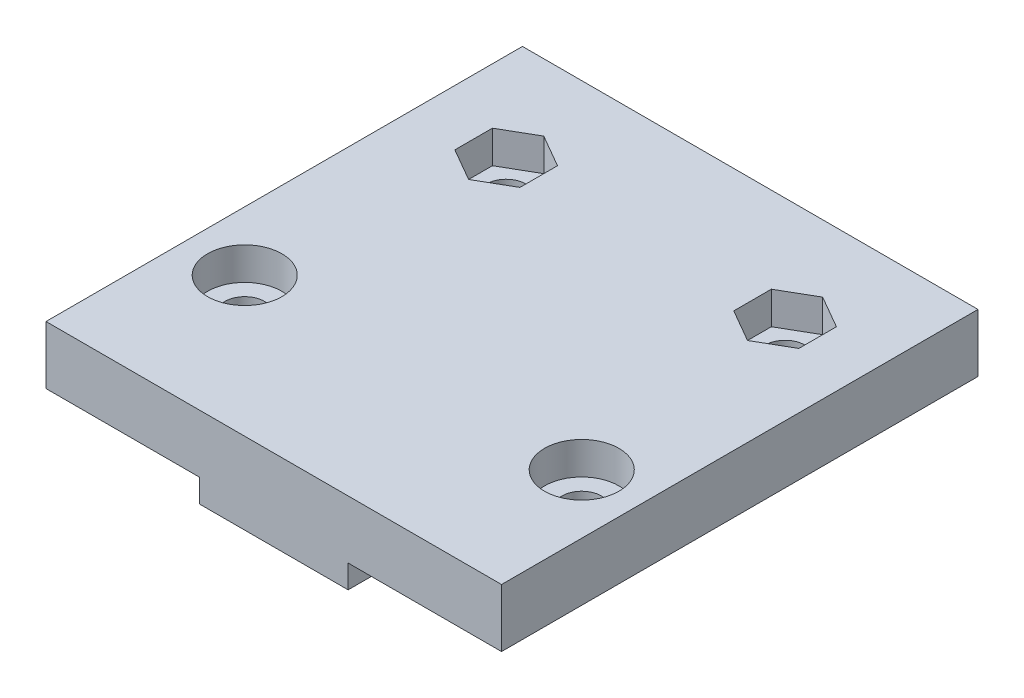
ISO-10303-21;
HEADER;
FILE_DESCRIPTION(('STEP AP214'),'2;1');
FILE_NAME('part.step','',(''),(''),'','','');
FILE_SCHEMA(('AUTOMOTIVE_DESIGN { 1 0 10303 214 1 1 1 1 }'));
ENDSEC;
DATA;
#1=APPLICATION_CONTEXT('core data for automotive mechanical design processes');
#2=APPLICATION_PROTOCOL_DEFINITION('international standard','automotive_design',2000,#1);
#3=PRODUCT_CONTEXT('',#1,'mechanical');
#4=PRODUCT('Part','Part','',(#3));
#5=PRODUCT_RELATED_PRODUCT_CATEGORY('part','',(#4));
#6=PRODUCT_DEFINITION_FORMATION('','',#4);
#7=PRODUCT_DEFINITION_CONTEXT('part definition',#1,'design');
#8=PRODUCT_DEFINITION('design','',#6,#7);
#9=PRODUCT_DEFINITION_SHAPE('','',#8);
#10=(LENGTH_UNIT() NAMED_UNIT(*) SI_UNIT(.MILLI.,.METRE.));
#11=(NAMED_UNIT(*) PLANE_ANGLE_UNIT() SI_UNIT($,.RADIAN.));
#12=(NAMED_UNIT(*) SI_UNIT($,.STERADIAN.) SOLID_ANGLE_UNIT());
#13=UNCERTAINTY_MEASURE_WITH_UNIT(LENGTH_MEASURE(1.E-05),#10,'distance_accuracy_value','');
#14=(GEOMETRIC_REPRESENTATION_CONTEXT(3) GLOBAL_UNCERTAINTY_ASSIGNED_CONTEXT((#13)) GLOBAL_UNIT_ASSIGNED_CONTEXT((#10,
#11,#12)) REPRESENTATION_CONTEXT('',''));
#15=CARTESIAN_POINT('',(0.,0.,0.));
#16=DIRECTION('',(0.,0.,1.));
#17=DIRECTION('',(1.,0.,0.));
#18=AXIS2_PLACEMENT_3D('',#15,#16,#17);
#19=CARTESIAN_POINT('',(14.5,22.5,-6.));
#20=DIRECTION('',(0.,-1.,0.));
#21=DIRECTION('',(1.,0.,0.));
#22=AXIS2_PLACEMENT_3D('',#19,#20,#21);
#23=CYLINDRICAL_SURFACE('',#22,1.7);
#24=CARTESIAN_POINT('',(14.5,5.,-6.));
#25=DIRECTION('',(0.,1.,0.));
#26=DIRECTION('',(-1.,0.,0.));
#27=AXIS2_PLACEMENT_3D('',#24,#25,#26);
#28=CIRCLE('',#27,1.7);
#29=CARTESIAN_POINT('',(12.8,5.,-6.));
#30=VERTEX_POINT('',#29);
#31=EDGE_CURVE('E236',#30,#30,#28,.F.);
#32=ORIENTED_EDGE('',*,*,#31,.T.);
#33=EDGE_LOOP('',(#32));
#34=FACE_BOUND('',#33,.T.);
#35=CARTESIAN_POINT('',(14.5,7.2,-6.));
#36=DIRECTION('',(0.,1.,0.));
#37=DIRECTION('',(-1.,0.,0.));
#38=AXIS2_PLACEMENT_3D('',#35,#36,#37);
#39=CIRCLE('',#38,1.7);
#40=CARTESIAN_POINT('',(12.8,7.2,-6.));
#41=VERTEX_POINT('',#40);
#42=EDGE_CURVE('E248',#41,#41,#39,.F.);
#43=ORIENTED_EDGE('',*,*,#42,.F.);
#44=EDGE_LOOP('',(#43));
#45=FACE_BOUND('',#44,.T.);
#46=ADVANCED_FACE('F35',(#34,#45),#23,.F.);
#47=CARTESIAN_POINT('',(-12.,22.5,-26.));
#48=DIRECTION('',(0.,-1.,0.));
#49=DIRECTION('',(1.,0.,0.));
#50=AXIS2_PLACEMENT_3D('',#47,#48,#49);
#51=CYLINDRICAL_SURFACE('',#50,1.7);
#52=CARTESIAN_POINT('',(-12.,5.,-26.));
#53=DIRECTION('',(0.,1.,0.));
#54=DIRECTION('',(-1.,0.,0.));
#55=AXIS2_PLACEMENT_3D('',#52,#53,#54);
#56=CIRCLE('',#55,1.7);
#57=CARTESIAN_POINT('',(-13.7,5.,-26.));
#58=VERTEX_POINT('',#57);
#59=EDGE_CURVE('E221',#58,#58,#56,.F.);
#60=ORIENTED_EDGE('',*,*,#59,.T.);
#61=EDGE_LOOP('',(#60));
#62=FACE_BOUND('',#61,.T.);
#63=CARTESIAN_POINT('',(-12.,7.2,-26.));
#64=DIRECTION('',(0.,1.,0.));
#65=DIRECTION('',(0.,0.,1.));
#66=AXIS2_PLACEMENT_3D('',#63,#64,#65);
#67=CIRCLE('',#66,1.7);
#68=CARTESIAN_POINT('',(-12.,7.2,-24.3));
#69=VERTEX_POINT('',#68);
#70=EDGE_CURVE('E241',#69,#69,#67,.F.);
#71=ORIENTED_EDGE('',*,*,#70,.F.);
#72=EDGE_LOOP('',(#71));
#73=FACE_BOUND('',#72,.T.);
#74=ADVANCED_FACE('F486',(#62,#73),#51,.F.);
#75=CARTESIAN_POINT('',(0.,0.,6.));
#76=DIRECTION('',(0.,0.,1.));
#77=DIRECTION('',(1.,0.,0.));
#78=AXIS2_PLACEMENT_3D('',#75,#76,#77);
#79=PLANE('',#78);
#80=DIRECTION('',(0.,1.,0.));
#81=VECTOR('',#80,1.);
#82=CARTESIAN_POINT('',(19.6,-36.0019511730844,6.));
#83=LINE('',#82,#81);
#84=CARTESIAN_POINT('',(19.6,5.,6.));
#85=VERTEX_POINT('',#84);
#86=CARTESIAN_POINT('',(19.6,10.,6.));
#87=VERTEX_POINT('',#86);
#88=EDGE_CURVE('E52',#85,#87,#83,.T.);
#89=ORIENTED_EDGE('',*,*,#88,.T.);
#90=DIRECTION('',(-1.,0.,0.));
#91=VECTOR('',#90,1.);
#92=CARTESIAN_POINT('',(20.,10.,6.));
#93=LINE('',#92,#91);
#94=CARTESIAN_POINT('',(-19.6,10.,6.));
#95=VERTEX_POINT('',#94);
#96=EDGE_CURVE('E210',#87,#95,#93,.T.);
#97=ORIENTED_EDGE('',*,*,#96,.T.);
#98=DIRECTION('',(0.,1.,0.));
#99=VECTOR('',#98,1.);
#100=CARTESIAN_POINT('',(-19.6,-36.0019511730844,6.));
#101=LINE('',#100,#99);
#102=CARTESIAN_POINT('',(-19.6,5.,6.));
#103=VERTEX_POINT('',#102);
#104=EDGE_CURVE('E367',#103,#95,#101,.T.);
#105=ORIENTED_EDGE('',*,*,#104,.F.);
#106=DIRECTION('',(-1.,0.,0.));
#107=VECTOR('',#106,1.);
#108=CARTESIAN_POINT('',(-20.,4.99999999999999,6.));
#109=LINE('',#108,#107);
#110=CARTESIAN_POINT('',(-6.4,5.,6.));
#111=VERTEX_POINT('',#110);
#112=EDGE_CURVE('E235',#111,#103,#109,.T.);
#113=ORIENTED_EDGE('',*,*,#112,.F.);
#114=DIRECTION('',(0.,-1.,0.));
#115=VECTOR('',#114,1.);
#116=CARTESIAN_POINT('',(-6.40000000000001,49.0113621693308,6.));
#117=LINE('',#116,#115);
#118=CARTESIAN_POINT('',(-6.4,3.,6.));
#119=VERTEX_POINT('',#118);
#120=EDGE_CURVE('E329',#111,#119,#117,.T.);
#121=ORIENTED_EDGE('',*,*,#120,.T.);
#122=DIRECTION('',(-1.,0.,0.));
#123=VECTOR('',#122,1.);
#124=CARTESIAN_POINT('',(-7.,3.,6.));
#125=LINE('',#124,#123);
#126=CARTESIAN_POINT('',(6.4,3.,6.));
#127=VERTEX_POINT('',#126);
#128=EDGE_CURVE('E226',#127,#119,#125,.T.);
#129=ORIENTED_EDGE('',*,*,#128,.F.);
#130=DIRECTION('',(0.,-1.,0.));
#131=VECTOR('',#130,1.);
#132=CARTESIAN_POINT('',(6.40000000000001,49.0113621693308,6.));
#133=LINE('',#132,#131);
#134=CARTESIAN_POINT('',(6.4,5.,6.));
#135=VERTEX_POINT('',#134);
#136=EDGE_CURVE('E299',#135,#127,#133,.T.);
#137=ORIENTED_EDGE('',*,*,#136,.F.);
#138=DIRECTION('',(1.,0.,0.));
#139=VECTOR('',#138,1.);
#140=CARTESIAN_POINT('',(20.,5.,6.));
#141=LINE('',#140,#139);
#142=EDGE_CURVE('E307',#135,#85,#141,.T.);
#143=ORIENTED_EDGE('',*,*,#142,.T.);
#144=EDGE_LOOP('',(#89,#97,#105,#113,#121,#129,#137,#143));
#145=FACE_BOUND('',#144,.T.);
#146=ADVANCED_FACE('F492',(#145),#79,.T.);
#147=CARTESIAN_POINT('',(0.,0.,-35.));
#148=DIRECTION('',(0.,0.,1.));
#149=DIRECTION('',(1.,0.,0.));
#150=AXIS2_PLACEMENT_3D('',#147,#148,#149);
#151=PLANE('',#150);
#152=DIRECTION('',(-1.,0.,0.));
#153=VECTOR('',#152,1.);
#154=CARTESIAN_POINT('',(-20.,10.,-35.));
#155=LINE('',#154,#153);
#156=CARTESIAN_POINT('',(19.6,10.,-35.));
#157=VERTEX_POINT('',#156);
#158=CARTESIAN_POINT('',(-19.6,10.,-35.));
#159=VERTEX_POINT('',#158);
#160=EDGE_CURVE('E209',#157,#159,#155,.T.);
#161=ORIENTED_EDGE('',*,*,#160,.F.);
#162=DIRECTION('',(0.,1.,0.));
#163=VECTOR('',#162,1.);
#164=CARTESIAN_POINT('',(19.6,-36.0019511730844,-35.));
#165=LINE('',#164,#163);
#166=CARTESIAN_POINT('',(19.6,5.00000000000001,-35.));
#167=VERTEX_POINT('',#166);
#168=EDGE_CURVE('E197',#167,#157,#165,.T.);
#169=ORIENTED_EDGE('',*,*,#168,.F.);
#170=DIRECTION('',(-1.,0.,0.));
#171=VECTOR('',#170,1.);
#172=CARTESIAN_POINT('',(4.00000000000002,5.,-35.));
#173=LINE('',#172,#171);
#174=CARTESIAN_POINT('',(4.,5.,-35.));
#175=VERTEX_POINT('',#174);
#176=EDGE_CURVE('E305',#167,#175,#173,.T.);
#177=ORIENTED_EDGE('',*,*,#176,.T.);
#178=DIRECTION('',(0.,-1.,0.));
#179=VECTOR('',#178,1.);
#180=CARTESIAN_POINT('',(4.00000000000001,49.0113621693308,-35.));
#181=LINE('',#180,#179);
#182=CARTESIAN_POINT('',(4.,3.,-35.));
#183=VERTEX_POINT('',#182);
#184=EDGE_CURVE('E244',#175,#183,#181,.T.);
#185=ORIENTED_EDGE('',*,*,#184,.T.);
#186=DIRECTION('',(1.,0.,0.));
#187=VECTOR('',#186,1.);
#188=CARTESIAN_POINT('',(4.5,3.,-35.));
#189=LINE('',#188,#187);
#190=CARTESIAN_POINT('',(-4.,3.,-35.));
#191=VERTEX_POINT('',#190);
#192=EDGE_CURVE('E228',#191,#183,#189,.T.);
#193=ORIENTED_EDGE('',*,*,#192,.F.);
#194=DIRECTION('',(0.,-1.,0.));
#195=VECTOR('',#194,1.);
#196=CARTESIAN_POINT('',(-4.00000000000001,49.0113621693308,-35.));
#197=LINE('',#196,#195);
#198=CARTESIAN_POINT('',(-4.,5.,-35.));
#199=VERTEX_POINT('',#198);
#200=EDGE_CURVE('E326',#199,#191,#197,.T.);
#201=ORIENTED_EDGE('',*,*,#200,.F.);
#202=DIRECTION('',(1.,0.,0.));
#203=VECTOR('',#202,1.);
#204=CARTESIAN_POINT('',(-4.,5.,-35.));
#205=LINE('',#204,#203);
#206=CARTESIAN_POINT('',(-19.6,5.,-35.));
#207=VERTEX_POINT('',#206);
#208=EDGE_CURVE('E322',#207,#199,#205,.T.);
#209=ORIENTED_EDGE('',*,*,#208,.F.);
#210=DIRECTION('',(0.,1.,0.));
#211=VECTOR('',#210,1.);
#212=CARTESIAN_POINT('',(-19.6,-36.0019511730844,-35.));
#213=LINE('',#212,#211);
#214=EDGE_CURVE('E60',#207,#159,#213,.T.);
#215=ORIENTED_EDGE('',*,*,#214,.T.);
#216=EDGE_LOOP('',(#161,#169,#177,#185,#193,#201,#209,#215));
#217=FACE_BOUND('',#216,.T.);
#218=ADVANCED_FACE('F212',(#217),#151,.F.);
#219=CARTESIAN_POINT('',(7.,3.,-0.999999999999997));
#220=DIRECTION('',(0.,0.,1.));
#221=DIRECTION('',(1.,0.,0.));
#222=AXIS2_PLACEMENT_3D('',#219,#220,#221);
#223=PLANE('',#222);
#224=DIRECTION('',(0.,-1.,0.));
#225=VECTOR('',#224,1.);
#226=CARTESIAN_POINT('',(6.40000000000001,49.0113621693308,-0.999999999999999));
#227=LINE('',#226,#225);
#228=CARTESIAN_POINT('',(6.4,5.,-0.999999999999999));
#229=VERTEX_POINT('',#228);
#230=CARTESIAN_POINT('',(6.4,3.,-0.999999999999999));
#231=VERTEX_POINT('',#230);
#232=EDGE_CURVE('E300',#229,#231,#227,.T.);
#233=ORIENTED_EDGE('',*,*,#232,.T.);
#234=DIRECTION('',(1.,0.,0.));
#235=VECTOR('',#234,1.);
#236=CARTESIAN_POINT('',(0.,3.,-0.999999999999998));
#237=LINE('',#236,#235);
#238=CARTESIAN_POINT('',(-6.4,3.,-0.999999999999999));
#239=VERTEX_POINT('',#238);
#240=EDGE_CURVE('E11',#239,#231,#237,.T.);
#241=ORIENTED_EDGE('',*,*,#240,.F.);
#242=DIRECTION('',(0.,-1.,0.));
#243=VECTOR('',#242,1.);
#244=CARTESIAN_POINT('',(-6.40000000000001,49.0113621693308,-0.999999999999999));
#245=LINE('',#244,#243);
#246=CARTESIAN_POINT('',(-6.4,5.,-0.999999999999999));
#247=VERTEX_POINT('',#246);
#248=EDGE_CURVE('E333',#247,#239,#245,.T.);
#249=ORIENTED_EDGE('',*,*,#248,.F.);
#250=DIRECTION('',(-1.,0.,0.));
#251=VECTOR('',#250,1.);
#252=CARTESIAN_POINT('',(-9.,5.,-0.999999999999999));
#253=LINE('',#252,#251);
#254=EDGE_CURVE('E218',#229,#247,#253,.T.);
#255=ORIENTED_EDGE('',*,*,#254,.F.);
#256=EDGE_LOOP('',(#233,#241,#249,#255));
#257=FACE_BOUND('',#256,.T.);
#258=ADVANCED_FACE('F506',(#257),#223,.F.);
#259=CARTESIAN_POINT('',(6.5,3.,-33.));
#260=DIRECTION('',(0.,0.,-1.));
#261=DIRECTION('',(-1.,0.,0.));
#262=AXIS2_PLACEMENT_3D('',#259,#260,#261);
#263=PLANE('',#262);
#264=DIRECTION('',(0.,-1.,0.));
#265=VECTOR('',#264,1.);
#266=CARTESIAN_POINT('',(4.00000000000001,49.0113621693308,-33.));
#267=LINE('',#266,#265);
#268=CARTESIAN_POINT('',(4.,5.,-33.));
#269=VERTEX_POINT('',#268);
#270=CARTESIAN_POINT('',(4.,3.,-33.));
#271=VERTEX_POINT('',#270);
#272=EDGE_CURVE('E295',#269,#271,#267,.T.);
#273=ORIENTED_EDGE('',*,*,#272,.F.);
#274=DIRECTION('',(1.,0.,0.));
#275=VECTOR('',#274,1.);
#276=CARTESIAN_POINT('',(6.5,5.,-33.));
#277=LINE('',#276,#275);
#278=CARTESIAN_POINT('',(-4.,5.,-33.));
#279=VERTEX_POINT('',#278);
#280=EDGE_CURVE('E214',#279,#269,#277,.T.);
#281=ORIENTED_EDGE('',*,*,#280,.F.);
#282=DIRECTION('',(0.,-1.,0.));
#283=VECTOR('',#282,1.);
#284=CARTESIAN_POINT('',(-4.00000000000001,49.0113621693308,-33.));
#285=LINE('',#284,#283);
#286=CARTESIAN_POINT('',(-4.,3.,-33.));
#287=VERTEX_POINT('',#286);
#288=EDGE_CURVE('E337',#279,#287,#285,.T.);
#289=ORIENTED_EDGE('',*,*,#288,.T.);
#290=DIRECTION('',(-1.,0.,0.));
#291=VECTOR('',#290,1.);
#292=CARTESIAN_POINT('',(0.,3.,-33.));
#293=LINE('',#292,#291);
#294=EDGE_CURVE('E44',#271,#287,#293,.T.);
#295=ORIENTED_EDGE('',*,*,#294,.F.);
#296=EDGE_LOOP('',(#273,#281,#289,#295));
#297=FACE_BOUND('',#296,.T.);
#298=ADVANCED_FACE('F357',(#297),#263,.F.);
#299=CARTESIAN_POINT('',(0.,3.,0.));
#300=DIRECTION('',(0.,1.,0.));
#301=DIRECTION('',(-1.,0.,0.));
#302=AXIS2_PLACEMENT_3D('',#299,#300,#301);
#303=PLANE('',#302);
#304=DIRECTION('',(0.,0.,1.));
#305=VECTOR('',#304,1.);
#306=CARTESIAN_POINT('',(4.,3.,-33.));
#307=LINE('',#306,#305);
#308=EDGE_CURVE('E292',#183,#271,#307,.T.);
#309=ORIENTED_EDGE('',*,*,#308,.T.);
#310=ORIENTED_EDGE('',*,*,#294,.T.);
#311=DIRECTION('',(0.,0.,1.));
#312=VECTOR('',#311,1.);
#313=CARTESIAN_POINT('',(-4.,3.,-33.));
#314=LINE('',#313,#312);
#315=EDGE_CURVE('E318',#191,#287,#314,.T.);
#316=ORIENTED_EDGE('',*,*,#315,.F.);
#317=ORIENTED_EDGE('',*,*,#192,.T.);
#318=EDGE_LOOP('',(#309,#310,#316,#317));
#319=FACE_BOUND('',#318,.T.);
#320=ADVANCED_FACE('F349',(#319),#303,.F.);
#321=DIRECTION('',(0.,0.,1.));
#322=VECTOR('',#321,1.);
#323=CARTESIAN_POINT('',(6.4,3.,6.));
#324=LINE('',#323,#322);
#325=EDGE_CURVE('E296',#231,#127,#324,.T.);
#326=ORIENTED_EDGE('',*,*,#325,.T.);
#327=ORIENTED_EDGE('',*,*,#128,.T.);
#328=DIRECTION('',(0.,0.,1.));
#329=VECTOR('',#328,1.);
#330=CARTESIAN_POINT('',(-6.4,3.,6.));
#331=LINE('',#330,#329);
#332=EDGE_CURVE('E319',#239,#119,#331,.T.);
#333=ORIENTED_EDGE('',*,*,#332,.F.);
#334=ORIENTED_EDGE('',*,*,#240,.T.);
#335=EDGE_LOOP('',(#326,#327,#333,#334));
#336=FACE_BOUND('',#335,.T.);
#337=ADVANCED_FACE('F473',(#336),#303,.F.);
#338=CARTESIAN_POINT('',(20.,10.,6.));
#339=DIRECTION('',(0.,-1.,0.));
#340=DIRECTION('',(1.,0.,0.));
#341=AXIS2_PLACEMENT_3D('',#338,#339,#340);
#342=PLANE('',#341);
#343=DIRECTION('',(0.866025403784439,0.,0.5));
#344=VECTOR('',#343,1.);
#345=CARTESIAN_POINT('',(12.,10.,-22.7668384925381));
#346=LINE('',#345,#344);
#347=CARTESIAN_POINT('',(9.2,10.,-24.3834192462691));
#348=VERTEX_POINT('',#347);
#349=CARTESIAN_POINT('',(12.,10.,-22.7668384925381));
#350=VERTEX_POINT('',#349);
#351=EDGE_CURVE('E400',#348,#350,#346,.T.);
#352=ORIENTED_EDGE('',*,*,#351,.F.);
#353=DIRECTION('',(0.,0.,1.));
#354=VECTOR('',#353,1.);
#355=CARTESIAN_POINT('',(9.2,10.,-24.3834192462691));
#356=LINE('',#355,#354);
#357=CARTESIAN_POINT('',(9.2,10.,-27.616580753731));
#358=VERTEX_POINT('',#357);
#359=EDGE_CURVE('E398',#358,#348,#356,.T.);
#360=ORIENTED_EDGE('',*,*,#359,.F.);
#361=DIRECTION('',(-0.866025403784439,0.,0.5));
#362=VECTOR('',#361,1.);
#363=CARTESIAN_POINT('',(9.2,10.,-27.616580753731));
#364=LINE('',#363,#362);
#365=CARTESIAN_POINT('',(12.,10.,-29.2331615074619));
#366=VERTEX_POINT('',#365);
#367=EDGE_CURVE('E382',#366,#358,#364,.T.);
#368=ORIENTED_EDGE('',*,*,#367,.F.);
#369=DIRECTION('',(-0.866025403784439,0.,-0.5));
#370=VECTOR('',#369,1.);
#371=CARTESIAN_POINT('',(12.,10.,-29.2331615074619));
#372=LINE('',#371,#370);
#373=CARTESIAN_POINT('',(14.8,10.,-27.616580753731));
#374=VERTEX_POINT('',#373);
#375=EDGE_CURVE('E410',#374,#366,#372,.T.);
#376=ORIENTED_EDGE('',*,*,#375,.F.);
#377=DIRECTION('',(0.,0.,-1.));
#378=VECTOR('',#377,1.);
#379=CARTESIAN_POINT('',(14.8,10.,-27.616580753731));
#380=LINE('',#379,#378);
#381=CARTESIAN_POINT('',(14.8,10.,-24.383419246269));
#382=VERTEX_POINT('',#381);
#383=EDGE_CURVE('E407',#382,#374,#380,.T.);
#384=ORIENTED_EDGE('',*,*,#383,.F.);
#385=DIRECTION('',(0.866025403784439,0.,-0.499999999999999));
#386=VECTOR('',#385,1.);
#387=CARTESIAN_POINT('',(14.8,10.,-24.383419246269));
#388=LINE('',#387,#386);
#389=EDGE_CURVE('E404',#350,#382,#388,.T.);
#390=ORIENTED_EDGE('',*,*,#389,.F.);
#391=EDGE_LOOP('',(#352,#360,#368,#376,#384,#390));
#392=FACE_BOUND('',#391,.T.);
#393=CARTESIAN_POINT('',(14.5,10.,-6.));
#394=DIRECTION('',(0.,1.,0.));
#395=DIRECTION('',(-1.,0.,0.));
#396=AXIS2_PLACEMENT_3D('',#393,#394,#395);
#397=CIRCLE('',#396,3.2);
#398=CARTESIAN_POINT('',(11.3,10.,-6.));
#399=VERTEX_POINT('',#398);
#400=EDGE_CURVE('E428',#399,#399,#397,.T.);
#401=ORIENTED_EDGE('',*,*,#400,.F.);
#402=EDGE_LOOP('',(#401));
#403=FACE_BOUND('',#402,.T.);
#404=CARTESIAN_POINT('',(-14.5,10.,-6.));
#405=DIRECTION('',(0.,1.,0.));
#406=DIRECTION('',(1.,0.,0.));
#407=AXIS2_PLACEMENT_3D('',#404,#405,#406);
#408=CIRCLE('',#407,3.2);
#409=CARTESIAN_POINT('',(-11.3,10.,-6.));
#410=VERTEX_POINT('',#409);
#411=EDGE_CURVE('E366',#410,#410,#408,.T.);
#412=ORIENTED_EDGE('',*,*,#411,.F.);
#413=EDGE_LOOP('',(#412));
#414=FACE_BOUND('',#413,.T.);
#415=DIRECTION('',(-0.866025403784438,0.,0.500000000000001));
#416=VECTOR('',#415,1.);
#417=CARTESIAN_POINT('',(-12.,10.,-29.2331615074619));
#418=LINE('',#417,#416);
#419=CARTESIAN_POINT('',(-12.,10.,-29.2331615074619));
#420=VERTEX_POINT('',#419);
#421=CARTESIAN_POINT('',(-14.8,10.,-27.616580753731));
#422=VERTEX_POINT('',#421);
#423=EDGE_CURVE('E257',#420,#422,#418,.T.);
#424=ORIENTED_EDGE('',*,*,#423,.F.);
#425=DIRECTION('',(-0.866025403784439,0.,-0.5));
#426=VECTOR('',#425,1.);
#427=CARTESIAN_POINT('',(-9.2,10.,-27.616580753731));
#428=LINE('',#427,#426);
#429=CARTESIAN_POINT('',(-9.2,10.,-27.616580753731));
#430=VERTEX_POINT('',#429);
#431=EDGE_CURVE('E254',#430,#420,#428,.T.);
#432=ORIENTED_EDGE('',*,*,#431,.F.);
#433=DIRECTION('',(0.,0.,-1.));
#434=VECTOR('',#433,1.);
#435=CARTESIAN_POINT('',(-9.2,10.,-24.3834192462691));
#436=LINE('',#435,#434);
#437=CARTESIAN_POINT('',(-9.2,10.,-24.3834192462691));
#438=VERTEX_POINT('',#437);
#439=EDGE_CURVE('E277',#438,#430,#436,.T.);
#440=ORIENTED_EDGE('',*,*,#439,.F.);
#441=DIRECTION('',(0.866025403784439,0.,-0.5));
#442=VECTOR('',#441,1.);
#443=CARTESIAN_POINT('',(-12.,10.,-22.7668384925381));
#444=LINE('',#443,#442);
#445=CARTESIAN_POINT('',(-12.,10.,-22.7668384925381));
#446=VERTEX_POINT('',#445);
#447=EDGE_CURVE('E274',#446,#438,#444,.T.);
#448=ORIENTED_EDGE('',*,*,#447,.F.);
#449=DIRECTION('',(0.866025403784439,0.,0.499999999999999));
#450=VECTOR('',#449,1.);
#451=CARTESIAN_POINT('',(-14.8,10.,-24.383419246269));
#452=LINE('',#451,#450);
#453=CARTESIAN_POINT('',(-14.8,10.,-24.383419246269));
#454=VERTEX_POINT('',#453);
#455=EDGE_CURVE('E271',#454,#446,#452,.T.);
#456=ORIENTED_EDGE('',*,*,#455,.F.);
#457=DIRECTION('',(0.,0.,1.));
#458=VECTOR('',#457,1.);
#459=CARTESIAN_POINT('',(-14.8,10.,-27.616580753731));
#460=LINE('',#459,#458);
#461=EDGE_CURVE('E263',#422,#454,#460,.T.);
#462=ORIENTED_EDGE('',*,*,#461,.F.);
#463=EDGE_LOOP('',(#424,#432,#440,#448,#456,#462));
#464=FACE_BOUND('',#463,.T.);
#465=ORIENTED_EDGE('',*,*,#96,.F.);
#466=DIRECTION('',(0.,0.,1.));
#467=VECTOR('',#466,1.);
#468=CARTESIAN_POINT('',(19.6,10.,-35.));
#469=LINE('',#468,#467);
#470=EDGE_CURVE('E200',#157,#87,#469,.T.);
#471=ORIENTED_EDGE('',*,*,#470,.F.);
#472=ORIENTED_EDGE('',*,*,#160,.T.);
#473=DIRECTION('',(0.,0.,-1.));
#474=VECTOR('',#473,1.);
#475=CARTESIAN_POINT('',(-19.6,10.,-35.));
#476=LINE('',#475,#474);
#477=EDGE_CURVE('E375',#95,#159,#476,.T.);
#478=ORIENTED_EDGE('',*,*,#477,.F.);
#479=EDGE_LOOP('',(#465,#471,#472,#478));
#480=FACE_BOUND('',#479,.T.);
#481=ADVANCED_FACE('F37',(#392,#403,#414,#464,#480),#342,.F.);
#482=CARTESIAN_POINT('',(0.,5.,0.));
#483=DIRECTION('',(0.,1.,0.));
#484=DIRECTION('',(-1.,0.,0.));
#485=AXIS2_PLACEMENT_3D('',#482,#483,#484);
#486=PLANE('',#485);
#487=ORIENTED_EDGE('',*,*,#176,.F.);
#488=DIRECTION('',(0.,0.,-1.));
#489=VECTOR('',#488,1.);
#490=CARTESIAN_POINT('',(19.6,5.00000000000001,-35.));
#491=LINE('',#490,#489);
#492=EDGE_CURVE('E201',#85,#167,#491,.T.);
#493=ORIENTED_EDGE('',*,*,#492,.F.);
#494=ORIENTED_EDGE('',*,*,#142,.F.);
#495=DIRECTION('',(0.,0.,1.));
#496=VECTOR('',#495,1.);
#497=CARTESIAN_POINT('',(6.4,5.,6.));
#498=LINE('',#497,#496);
#499=EDGE_CURVE('E240',#229,#135,#498,.T.);
#500=ORIENTED_EDGE('',*,*,#499,.F.);
#501=ORIENTED_EDGE('',*,*,#254,.T.);
#502=DIRECTION('',(0.,0.,1.));
#503=VECTOR('',#502,1.);
#504=CARTESIAN_POINT('',(-6.4,5.,6.));
#505=LINE('',#504,#503);
#506=EDGE_CURVE('E330',#247,#111,#505,.T.);
#507=ORIENTED_EDGE('',*,*,#506,.T.);
#508=ORIENTED_EDGE('',*,*,#112,.T.);
#509=DIRECTION('',(0.,0.,1.));
#510=VECTOR('',#509,1.);
#511=CARTESIAN_POINT('',(-19.6,5.,-35.));
#512=LINE('',#511,#510);
#513=EDGE_CURVE('E362',#207,#103,#512,.T.);
#514=ORIENTED_EDGE('',*,*,#513,.F.);
#515=ORIENTED_EDGE('',*,*,#208,.T.);
#516=DIRECTION('',(0.,0.,1.));
#517=VECTOR('',#516,1.);
#518=CARTESIAN_POINT('',(-4.,5.,-33.));
#519=LINE('',#518,#517);
#520=EDGE_CURVE('E334',#199,#279,#519,.T.);
#521=ORIENTED_EDGE('',*,*,#520,.T.);
#522=ORIENTED_EDGE('',*,*,#280,.T.);
#523=DIRECTION('',(0.,0.,1.));
#524=VECTOR('',#523,1.);
#525=CARTESIAN_POINT('',(4.,5.,-33.));
#526=LINE('',#525,#524);
#527=EDGE_CURVE('E303',#175,#269,#526,.T.);
#528=ORIENTED_EDGE('',*,*,#527,.F.);
#529=EDGE_LOOP('',(#487,#493,#494,#500,#501,#507,#508,#514,#515,#521,#522,#528));
#530=FACE_BOUND('',#529,.T.);
#531=CARTESIAN_POINT('',(-14.5,5.,-6.));
#532=DIRECTION('',(0.,1.,0.));
#533=DIRECTION('',(-1.,0.,0.));
#534=AXIS2_PLACEMENT_3D('',#531,#532,#533);
#535=CIRCLE('',#534,1.7);
#536=CARTESIAN_POINT('',(-16.2,5.,-6.));
#537=VERTEX_POINT('',#536);
#538=EDGE_CURVE('E215',#537,#537,#535,.F.);
#539=ORIENTED_EDGE('',*,*,#538,.F.);
#540=EDGE_LOOP('',(#539));
#541=FACE_BOUND('',#540,.T.);
#542=ORIENTED_EDGE('',*,*,#59,.F.);
#543=EDGE_LOOP('',(#542));
#544=FACE_BOUND('',#543,.T.);
#545=ORIENTED_EDGE('',*,*,#31,.F.);
#546=EDGE_LOOP('',(#545));
#547=FACE_BOUND('',#546,.T.);
#548=CARTESIAN_POINT('',(12.,5.,-26.));
#549=DIRECTION('',(0.,1.,0.));
#550=DIRECTION('',(-1.,0.,0.));
#551=AXIS2_PLACEMENT_3D('',#548,#549,#550);
#552=CIRCLE('',#551,1.7);
#553=CARTESIAN_POINT('',(10.3,5.,-26.));
#554=VERTEX_POINT('',#553);
#555=EDGE_CURVE('E239',#554,#554,#552,.F.);
#556=ORIENTED_EDGE('',*,*,#555,.F.);
#557=EDGE_LOOP('',(#556));
#558=FACE_BOUND('',#557,.T.);
#559=ADVANCED_FACE('F360',(#530,#541,#544,#547,#558),#486,.F.);
#560=CARTESIAN_POINT('',(12.,22.5,-26.));
#561=DIRECTION('',(0.,-1.,0.));
#562=DIRECTION('',(1.,0.,0.));
#563=AXIS2_PLACEMENT_3D('',#560,#561,#562);
#564=CYLINDRICAL_SURFACE('',#563,1.7);
#565=CARTESIAN_POINT('',(12.,7.2,-26.));
#566=DIRECTION('',(0.,-1.,0.));
#567=DIRECTION('',(0.,0.,-1.));
#568=AXIS2_PLACEMENT_3D('',#565,#566,#567);
#569=CIRCLE('',#568,1.7);
#570=CARTESIAN_POINT('',(12.,7.2,-27.7));
#571=VERTEX_POINT('',#570);
#572=EDGE_CURVE('E39',#571,#571,#569,.F.);
#573=ORIENTED_EDGE('',*,*,#572,.T.);
#574=EDGE_LOOP('',(#573));
#575=FACE_BOUND('',#574,.T.);
#576=ORIENTED_EDGE('',*,*,#555,.T.);
#577=EDGE_LOOP('',(#576));
#578=FACE_BOUND('',#577,.T.);
#579=ADVANCED_FACE('F479',(#575,#578),#564,.F.);
#580=CARTESIAN_POINT('',(-14.5,22.5,-6.));
#581=DIRECTION('',(0.,-1.,0.));
#582=DIRECTION('',(1.,0.,0.));
#583=AXIS2_PLACEMENT_3D('',#580,#581,#582);
#584=CYLINDRICAL_SURFACE('',#583,1.7);
#585=CARTESIAN_POINT('',(-14.5,7.2,-6.));
#586=DIRECTION('',(0.,-1.,0.));
#587=DIRECTION('',(1.,0.,0.));
#588=AXIS2_PLACEMENT_3D('',#585,#586,#587);
#589=CIRCLE('',#588,1.7);
#590=CARTESIAN_POINT('',(-12.8,7.2,-6.));
#591=VERTEX_POINT('',#590);
#592=EDGE_CURVE('E246',#591,#591,#589,.F.);
#593=ORIENTED_EDGE('',*,*,#592,.T.);
#594=EDGE_LOOP('',(#593));
#595=FACE_BOUND('',#594,.T.);
#596=ORIENTED_EDGE('',*,*,#538,.T.);
#597=EDGE_LOOP('',(#596));
#598=FACE_BOUND('',#597,.T.);
#599=ADVANCED_FACE('F499',(#595,#598),#584,.F.);
#600=CARTESIAN_POINT('',(-4.00000000000001,49.0113621693308,-33.));
#601=DIRECTION('',(1.,0.,0.));
#602=DIRECTION('',(0.,1.,0.));
#603=AXIS2_PLACEMENT_3D('',#600,#601,#602);
#604=PLANE('',#603);
#605=ORIENTED_EDGE('',*,*,#200,.T.);
#606=ORIENTED_EDGE('',*,*,#315,.T.);
#607=ORIENTED_EDGE('',*,*,#288,.F.);
#608=ORIENTED_EDGE('',*,*,#520,.F.);
#609=EDGE_LOOP('',(#605,#606,#607,#608));
#610=FACE_BOUND('',#609,.T.);
#611=ADVANCED_FACE('F346',(#610),#604,.F.);
#612=CARTESIAN_POINT('',(-6.40000000000001,49.0113621693308,6.));
#613=DIRECTION('',(1.,0.,0.));
#614=DIRECTION('',(0.,1.,0.));
#615=AXIS2_PLACEMENT_3D('',#612,#613,#614);
#616=PLANE('',#615);
#617=ORIENTED_EDGE('',*,*,#248,.T.);
#618=ORIENTED_EDGE('',*,*,#332,.T.);
#619=ORIENTED_EDGE('',*,*,#120,.F.);
#620=ORIENTED_EDGE('',*,*,#506,.F.);
#621=EDGE_LOOP('',(#617,#618,#619,#620));
#622=FACE_BOUND('',#621,.T.);
#623=ADVANCED_FACE('F528',(#622),#616,.F.);
#624=CARTESIAN_POINT('',(4.00000000000001,49.0113621693308,-33.));
#625=DIRECTION('',(1.,0.,0.));
#626=DIRECTION('',(0.,1.,0.));
#627=AXIS2_PLACEMENT_3D('',#624,#625,#626);
#628=PLANE('',#627);
#629=ORIENTED_EDGE('',*,*,#527,.T.);
#630=ORIENTED_EDGE('',*,*,#272,.T.);
#631=ORIENTED_EDGE('',*,*,#308,.F.);
#632=ORIENTED_EDGE('',*,*,#184,.F.);
#633=EDGE_LOOP('',(#629,#630,#631,#632));
#634=FACE_BOUND('',#633,.T.);
#635=ADVANCED_FACE('F354',(#634),#628,.T.);
#636=CARTESIAN_POINT('',(6.40000000000001,49.0113621693308,6.));
#637=DIRECTION('',(1.,0.,0.));
#638=DIRECTION('',(0.,1.,0.));
#639=AXIS2_PLACEMENT_3D('',#636,#637,#638);
#640=PLANE('',#639);
#641=ORIENTED_EDGE('',*,*,#499,.T.);
#642=ORIENTED_EDGE('',*,*,#136,.T.);
#643=ORIENTED_EDGE('',*,*,#325,.F.);
#644=ORIENTED_EDGE('',*,*,#232,.F.);
#645=EDGE_LOOP('',(#641,#642,#643,#644));
#646=FACE_BOUND('',#645,.T.);
#647=ADVANCED_FACE('F522',(#646),#640,.T.);
#648=CARTESIAN_POINT('',(0.,7.2,0.));
#649=DIRECTION('',(0.,1.,0.));
#650=DIRECTION('',(0.,0.,1.));
#651=AXIS2_PLACEMENT_3D('',#648,#649,#650);
#652=PLANE('',#651);
#653=DIRECTION('',(-0.866025403784439,0.,-0.5));
#654=VECTOR('',#653,1.);
#655=CARTESIAN_POINT('',(-9.2,7.2,-27.616580753731));
#656=LINE('',#655,#654);
#657=CARTESIAN_POINT('',(-9.2,7.2,-27.616580753731));
#658=VERTEX_POINT('',#657);
#659=CARTESIAN_POINT('',(-12.,7.2,-29.2331615074619));
#660=VERTEX_POINT('',#659);
#661=EDGE_CURVE('E280',#658,#660,#656,.T.);
#662=ORIENTED_EDGE('',*,*,#661,.T.);
#663=DIRECTION('',(-0.866025403784438,0.,0.500000000000001));
#664=VECTOR('',#663,1.);
#665=CARTESIAN_POINT('',(-12.,7.2,-29.2331615074619));
#666=LINE('',#665,#664);
#667=CARTESIAN_POINT('',(-14.8,7.2,-27.616580753731));
#668=VERTEX_POINT('',#667);
#669=EDGE_CURVE('E435',#660,#668,#666,.T.);
#670=ORIENTED_EDGE('',*,*,#669,.T.);
#671=DIRECTION('',(0.,0.,1.));
#672=VECTOR('',#671,1.);
#673=CARTESIAN_POINT('',(-14.8,7.2,-27.616580753731));
#674=LINE('',#673,#672);
#675=CARTESIAN_POINT('',(-14.8,7.2,-24.383419246269));
#676=VERTEX_POINT('',#675);
#677=EDGE_CURVE('E438',#668,#676,#674,.T.);
#678=ORIENTED_EDGE('',*,*,#677,.T.);
#679=DIRECTION('',(0.866025403784439,0.,0.499999999999999));
#680=VECTOR('',#679,1.);
#681=CARTESIAN_POINT('',(-14.8,7.2,-24.383419246269));
#682=LINE('',#681,#680);
#683=CARTESIAN_POINT('',(-12.,7.2,-22.7668384925381));
#684=VERTEX_POINT('',#683);
#685=EDGE_CURVE('E441',#676,#684,#682,.T.);
#686=ORIENTED_EDGE('',*,*,#685,.T.);
#687=DIRECTION('',(0.866025403784439,0.,-0.5));
#688=VECTOR('',#687,1.);
#689=CARTESIAN_POINT('',(-12.,7.2,-22.7668384925381));
#690=LINE('',#689,#688);
#691=CARTESIAN_POINT('',(-9.2,7.2,-24.3834192462691));
#692=VERTEX_POINT('',#691);
#693=EDGE_CURVE('E443',#684,#692,#690,.T.);
#694=ORIENTED_EDGE('',*,*,#693,.T.);
#695=DIRECTION('',(0.,0.,-1.));
#696=VECTOR('',#695,1.);
#697=CARTESIAN_POINT('',(-9.2,7.2,-24.3834192462691));
#698=LINE('',#697,#696);
#699=EDGE_CURVE('E266',#692,#658,#698,.T.);
#700=ORIENTED_EDGE('',*,*,#699,.T.);
#701=EDGE_LOOP('',(#662,#670,#678,#686,#694,#700));
#702=FACE_BOUND('',#701,.T.);
#703=ORIENTED_EDGE('',*,*,#70,.T.);
#704=EDGE_LOOP('',(#703));
#705=FACE_BOUND('',#704,.T.);
#706=ADVANCED_FACE('F449',(#702,#705),#652,.T.);
#707=CARTESIAN_POINT('',(-9.2,7.2,-27.616580753731));
#708=DIRECTION('',(0.5,0.,-0.866025403784439));
#709=DIRECTION('',(-0.866025403784439,0.,-0.5));
#710=AXIS2_PLACEMENT_3D('',#707,#708,#709);
#711=PLANE('',#710);
#712=ORIENTED_EDGE('',*,*,#431,.T.);
#713=DIRECTION('',(0.,1.,0.));
#714=VECTOR('',#713,1.);
#715=CARTESIAN_POINT('',(-12.,7.2,-29.2331615074619));
#716=LINE('',#715,#714);
#717=EDGE_CURVE('E290',#660,#420,#716,.T.);
#718=ORIENTED_EDGE('',*,*,#717,.F.);
#719=ORIENTED_EDGE('',*,*,#661,.F.);
#720=DIRECTION('',(0.,1.,0.));
#721=VECTOR('',#720,1.);
#722=CARTESIAN_POINT('',(-9.2,7.2,-27.616580753731));
#723=LINE('',#722,#721);
#724=EDGE_CURVE('E245',#658,#430,#723,.T.);
#725=ORIENTED_EDGE('',*,*,#724,.T.);
#726=EDGE_LOOP('',(#712,#718,#719,#725));
#727=FACE_BOUND('',#726,.T.);
#728=ADVANCED_FACE('F455',(#727),#711,.F.);
#729=CARTESIAN_POINT('',(-9.2,7.2,-24.3834192462691));
#730=DIRECTION('',(1.,0.,0.));
#731=DIRECTION('',(0.,1.,0.));
#732=AXIS2_PLACEMENT_3D('',#729,#730,#731);
#733=PLANE('',#732);
#734=ORIENTED_EDGE('',*,*,#439,.T.);
#735=ORIENTED_EDGE('',*,*,#724,.F.);
#736=ORIENTED_EDGE('',*,*,#699,.F.);
#737=DIRECTION('',(0.,1.,0.));
#738=VECTOR('',#737,1.);
#739=CARTESIAN_POINT('',(-9.2,7.2,-24.3834192462691));
#740=LINE('',#739,#738);
#741=EDGE_CURVE('E282',#692,#438,#740,.T.);
#742=ORIENTED_EDGE('',*,*,#741,.T.);
#743=EDGE_LOOP('',(#734,#735,#736,#742));
#744=FACE_BOUND('',#743,.T.);
#745=ADVANCED_FACE('F453',(#744),#733,.F.);
#746=CARTESIAN_POINT('',(-12.,7.2,-22.7668384925381));
#747=DIRECTION('',(0.5,0.,0.866025403784439));
#748=DIRECTION('',(0.866025403784439,0.,-0.5));
#749=AXIS2_PLACEMENT_3D('',#746,#747,#748);
#750=PLANE('',#749);
#751=ORIENTED_EDGE('',*,*,#447,.T.);
#752=ORIENTED_EDGE('',*,*,#741,.F.);
#753=ORIENTED_EDGE('',*,*,#693,.F.);
#754=DIRECTION('',(0.,1.,0.));
#755=VECTOR('',#754,1.);
#756=CARTESIAN_POINT('',(-12.,7.2,-22.7668384925381));
#757=LINE('',#756,#755);
#758=EDGE_CURVE('E284',#684,#446,#757,.T.);
#759=ORIENTED_EDGE('',*,*,#758,.T.);
#760=EDGE_LOOP('',(#751,#752,#753,#759));
#761=FACE_BOUND('',#760,.T.);
#762=ADVANCED_FACE('F470',(#761),#750,.F.);
#763=CARTESIAN_POINT('',(-14.8,7.2,-24.383419246269));
#764=DIRECTION('',(-0.499999999999999,0.,0.866025403784439));
#765=DIRECTION('',(0.866025403784439,0.,0.499999999999999));
#766=AXIS2_PLACEMENT_3D('',#763,#764,#765);
#767=PLANE('',#766);
#768=ORIENTED_EDGE('',*,*,#455,.T.);
#769=ORIENTED_EDGE('',*,*,#758,.F.);
#770=ORIENTED_EDGE('',*,*,#685,.F.);
#771=DIRECTION('',(0.,1.,0.));
#772=VECTOR('',#771,1.);
#773=CARTESIAN_POINT('',(-14.8,7.2,-24.383419246269));
#774=LINE('',#773,#772);
#775=EDGE_CURVE('E286',#676,#454,#774,.T.);
#776=ORIENTED_EDGE('',*,*,#775,.T.);
#777=EDGE_LOOP('',(#768,#769,#770,#776));
#778=FACE_BOUND('',#777,.T.);
#779=ADVANCED_FACE('F467',(#778),#767,.F.);
#780=CARTESIAN_POINT('',(-14.8,7.2,-27.616580753731));
#781=DIRECTION('',(-1.,0.,0.));
#782=DIRECTION('',(0.,-1.,0.));
#783=AXIS2_PLACEMENT_3D('',#780,#781,#782);
#784=PLANE('',#783);
#785=ORIENTED_EDGE('',*,*,#461,.T.);
#786=ORIENTED_EDGE('',*,*,#775,.F.);
#787=ORIENTED_EDGE('',*,*,#677,.F.);
#788=DIRECTION('',(0.,1.,0.));
#789=VECTOR('',#788,1.);
#790=CARTESIAN_POINT('',(-14.8,7.2,-27.616580753731));
#791=LINE('',#790,#789);
#792=EDGE_CURVE('E288',#668,#422,#791,.T.);
#793=ORIENTED_EDGE('',*,*,#792,.T.);
#794=EDGE_LOOP('',(#785,#786,#787,#793));
#795=FACE_BOUND('',#794,.T.);
#796=ADVANCED_FACE('F463',(#795),#784,.F.);
#797=CARTESIAN_POINT('',(-12.,7.2,-29.2331615074619));
#798=DIRECTION('',(-0.500000000000001,0.,-0.866025403784438));
#799=DIRECTION('',(-0.866025403784438,0.,0.500000000000001));
#800=AXIS2_PLACEMENT_3D('',#797,#798,#799);
#801=PLANE('',#800);
#802=ORIENTED_EDGE('',*,*,#423,.T.);
#803=ORIENTED_EDGE('',*,*,#792,.F.);
#804=ORIENTED_EDGE('',*,*,#669,.F.);
#805=ORIENTED_EDGE('',*,*,#717,.T.);
#806=EDGE_LOOP('',(#802,#803,#804,#805));
#807=FACE_BOUND('',#806,.T.);
#808=ADVANCED_FACE('F459',(#807),#801,.F.);
#809=CARTESIAN_POINT('',(-14.5,7.2,-6.));
#810=DIRECTION('',(0.,-1.,0.));
#811=DIRECTION('',(1.,0.,0.));
#812=AXIS2_PLACEMENT_3D('',#809,#810,#811);
#813=PLANE('',#812);
#814=CARTESIAN_POINT('',(-14.5,7.2,-6.));
#815=DIRECTION('',(0.,1.,0.));
#816=DIRECTION('',(1.,0.,0.));
#817=AXIS2_PLACEMENT_3D('',#814,#815,#816);
#818=CIRCLE('',#817,3.2);
#819=CARTESIAN_POINT('',(-11.3,7.2,-6.));
#820=VERTEX_POINT('',#819);
#821=EDGE_CURVE('E370',#820,#820,#818,.T.);
#822=ORIENTED_EDGE('',*,*,#821,.T.);
#823=EDGE_LOOP('',(#822));
#824=FACE_BOUND('',#823,.T.);
#825=ORIENTED_EDGE('',*,*,#592,.F.);
#826=EDGE_LOOP('',(#825));
#827=FACE_BOUND('',#826,.T.);
#828=ADVANCED_FACE('F575',(#824,#827),#813,.F.);
#829=CARTESIAN_POINT('',(-14.5,7.2,-6.));
#830=DIRECTION('',(0.,1.,0.));
#831=DIRECTION('',(-1.,0.,0.));
#832=AXIS2_PLACEMENT_3D('',#829,#830,#831);
#833=CYLINDRICAL_SURFACE('',#832,3.2);
#834=ORIENTED_EDGE('',*,*,#821,.F.);
#835=EDGE_LOOP('',(#834));
#836=FACE_BOUND('',#835,.T.);
#837=ORIENTED_EDGE('',*,*,#411,.T.);
#838=EDGE_LOOP('',(#837));
#839=FACE_BOUND('',#838,.T.);
#840=ADVANCED_FACE('F570',(#836,#839),#833,.F.);
#841=CARTESIAN_POINT('',(14.5,7.2,-6.));
#842=DIRECTION('',(0.,1.,0.));
#843=DIRECTION('',(-1.,0.,0.));
#844=AXIS2_PLACEMENT_3D('',#841,#842,#843);
#845=PLANE('',#844);
#846=CARTESIAN_POINT('',(14.5,7.2,-6.));
#847=DIRECTION('',(0.,1.,0.));
#848=DIRECTION('',(-1.,0.,0.));
#849=AXIS2_PLACEMENT_3D('',#846,#847,#848);
#850=CIRCLE('',#849,3.2);
#851=CARTESIAN_POINT('',(11.3,7.2,-6.));
#852=VERTEX_POINT('',#851);
#853=EDGE_CURVE('E401',#852,#852,#850,.T.);
#854=ORIENTED_EDGE('',*,*,#853,.T.);
#855=EDGE_LOOP('',(#854));
#856=FACE_BOUND('',#855,.T.);
#857=ORIENTED_EDGE('',*,*,#42,.T.);
#858=EDGE_LOOP('',(#857));
#859=FACE_BOUND('',#858,.T.);
#860=ADVANCED_FACE('F567',(#856,#859),#845,.T.);
#861=CARTESIAN_POINT('',(14.5,7.2,-6.));
#862=DIRECTION('',(0.,1.,0.));
#863=DIRECTION('',(-1.,0.,0.));
#864=AXIS2_PLACEMENT_3D('',#861,#862,#863);
#865=CYLINDRICAL_SURFACE('',#864,3.2);
#866=ORIENTED_EDGE('',*,*,#853,.F.);
#867=EDGE_LOOP('',(#866));
#868=FACE_BOUND('',#867,.T.);
#869=ORIENTED_EDGE('',*,*,#400,.T.);
#870=EDGE_LOOP('',(#869));
#871=FACE_BOUND('',#870,.T.);
#872=ADVANCED_FACE('F547',(#868,#871),#865,.F.);
#873=CARTESIAN_POINT('',(0.,7.2,0.));
#874=DIRECTION('',(0.,-1.,0.));
#875=DIRECTION('',(0.,0.,-1.));
#876=AXIS2_PLACEMENT_3D('',#873,#874,#875);
#877=PLANE('',#876);
#878=DIRECTION('',(0.,0.,1.));
#879=VECTOR('',#878,1.);
#880=CARTESIAN_POINT('',(9.2,7.2,-24.3834192462691));
#881=LINE('',#880,#879);
#882=CARTESIAN_POINT('',(9.2,7.2,-27.616580753731));
#883=VERTEX_POINT('',#882);
#884=CARTESIAN_POINT('',(9.2,7.2,-24.3834192462691));
#885=VERTEX_POINT('',#884);
#886=EDGE_CURVE('E378',#883,#885,#881,.T.);
#887=ORIENTED_EDGE('',*,*,#886,.T.);
#888=DIRECTION('',(0.866025403784439,0.,0.5));
#889=VECTOR('',#888,1.);
#890=CARTESIAN_POINT('',(12.,7.2,-22.7668384925381));
#891=LINE('',#890,#889);
#892=CARTESIAN_POINT('',(12.,7.2,-22.7668384925381));
#893=VERTEX_POINT('',#892);
#894=EDGE_CURVE('E381',#885,#893,#891,.T.);
#895=ORIENTED_EDGE('',*,*,#894,.T.);
#896=DIRECTION('',(0.866025403784439,0.,-0.499999999999999));
#897=VECTOR('',#896,1.);
#898=CARTESIAN_POINT('',(14.8,7.2,-24.383419246269));
#899=LINE('',#898,#897);
#900=CARTESIAN_POINT('',(14.8,7.2,-24.383419246269));
#901=VERTEX_POINT('',#900);
#902=EDGE_CURVE('E385',#893,#901,#899,.T.);
#903=ORIENTED_EDGE('',*,*,#902,.T.);
#904=DIRECTION('',(0.,0.,-1.));
#905=VECTOR('',#904,1.);
#906=CARTESIAN_POINT('',(14.8,7.2,-27.616580753731));
#907=LINE('',#906,#905);
#908=CARTESIAN_POINT('',(14.8,7.2,-27.616580753731));
#909=VERTEX_POINT('',#908);
#910=EDGE_CURVE('E388',#901,#909,#907,.T.);
#911=ORIENTED_EDGE('',*,*,#910,.T.);
#912=DIRECTION('',(-0.866025403784439,0.,-0.5));
#913=VECTOR('',#912,1.);
#914=CARTESIAN_POINT('',(12.,7.2,-29.2331615074619));
#915=LINE('',#914,#913);
#916=CARTESIAN_POINT('',(12.,7.2,-29.2331615074619));
#917=VERTEX_POINT('',#916);
#918=EDGE_CURVE('E391',#909,#917,#915,.T.);
#919=ORIENTED_EDGE('',*,*,#918,.T.);
#920=DIRECTION('',(-0.866025403784439,0.,0.5));
#921=VECTOR('',#920,1.);
#922=CARTESIAN_POINT('',(9.2,7.2,-27.616580753731));
#923=LINE('',#922,#921);
#924=EDGE_CURVE('E394',#917,#883,#923,.T.);
#925=ORIENTED_EDGE('',*,*,#924,.T.);
#926=EDGE_LOOP('',(#887,#895,#903,#911,#919,#925));
#927=FACE_BOUND('',#926,.T.);
#928=ORIENTED_EDGE('',*,*,#572,.F.);
#929=EDGE_LOOP('',(#928));
#930=FACE_BOUND('',#929,.T.);
#931=ADVANCED_FACE('F543',(#927,#930),#877,.F.);
#932=CARTESIAN_POINT('',(9.2,7.2,-24.3834192462691));
#933=DIRECTION('',(-1.,0.,0.));
#934=DIRECTION('',(0.,-1.,0.));
#935=AXIS2_PLACEMENT_3D('',#932,#933,#934);
#936=PLANE('',#935);
#937=ORIENTED_EDGE('',*,*,#359,.T.);
#938=DIRECTION('',(0.,1.,0.));
#939=VECTOR('',#938,1.);
#940=CARTESIAN_POINT('',(9.2,7.2,-24.3834192462691));
#941=LINE('',#940,#939);
#942=EDGE_CURVE('E397',#885,#348,#941,.T.);
#943=ORIENTED_EDGE('',*,*,#942,.F.);
#944=ORIENTED_EDGE('',*,*,#886,.F.);
#945=DIRECTION('',(0.,1.,0.));
#946=VECTOR('',#945,1.);
#947=CARTESIAN_POINT('',(9.2,7.2,-27.616580753731));
#948=LINE('',#947,#946);
#949=EDGE_CURVE('E249',#883,#358,#948,.T.);
#950=ORIENTED_EDGE('',*,*,#949,.T.);
#951=EDGE_LOOP('',(#937,#943,#944,#950));
#952=FACE_BOUND('',#951,.T.);
#953=ADVANCED_FACE('F546',(#952),#936,.F.);
#954=CARTESIAN_POINT('',(9.2,7.2,-27.616580753731));
#955=DIRECTION('',(-0.5,0.,-0.866025403784439));
#956=DIRECTION('',(-0.866025403784439,0.,0.5));
#957=AXIS2_PLACEMENT_3D('',#954,#955,#956);
#958=PLANE('',#957);
#959=ORIENTED_EDGE('',*,*,#367,.T.);
#960=ORIENTED_EDGE('',*,*,#949,.F.);
#961=ORIENTED_EDGE('',*,*,#924,.F.);
#962=DIRECTION('',(0.,1.,0.));
#963=VECTOR('',#962,1.);
#964=CARTESIAN_POINT('',(12.,7.2,-29.2331615074619));
#965=LINE('',#964,#963);
#966=EDGE_CURVE('E416',#917,#366,#965,.T.);
#967=ORIENTED_EDGE('',*,*,#966,.T.);
#968=EDGE_LOOP('',(#959,#960,#961,#967));
#969=FACE_BOUND('',#968,.T.);
#970=ADVANCED_FACE('F549',(#969),#958,.F.);
#971=CARTESIAN_POINT('',(12.,7.2,-29.2331615074619));
#972=DIRECTION('',(0.5,0.,-0.866025403784438));
#973=DIRECTION('',(-0.866025403784439,0.,-0.5));
#974=AXIS2_PLACEMENT_3D('',#971,#972,#973);
#975=PLANE('',#974);
#976=ORIENTED_EDGE('',*,*,#375,.T.);
#977=ORIENTED_EDGE('',*,*,#966,.F.);
#978=ORIENTED_EDGE('',*,*,#918,.F.);
#979=DIRECTION('',(0.,1.,0.));
#980=VECTOR('',#979,1.);
#981=CARTESIAN_POINT('',(14.8,7.2,-27.616580753731));
#982=LINE('',#981,#980);
#983=EDGE_CURVE('E418',#909,#374,#982,.T.);
#984=ORIENTED_EDGE('',*,*,#983,.T.);
#985=EDGE_LOOP('',(#976,#977,#978,#984));
#986=FACE_BOUND('',#985,.T.);
#987=ADVANCED_FACE('F552',(#986),#975,.F.);
#988=CARTESIAN_POINT('',(14.8,7.2,-27.616580753731));
#989=DIRECTION('',(1.,0.,0.));
#990=DIRECTION('',(0.,1.,0.));
#991=AXIS2_PLACEMENT_3D('',#988,#989,#990);
#992=PLANE('',#991);
#993=ORIENTED_EDGE('',*,*,#383,.T.);
#994=ORIENTED_EDGE('',*,*,#983,.F.);
#995=ORIENTED_EDGE('',*,*,#910,.F.);
#996=DIRECTION('',(0.,1.,0.));
#997=VECTOR('',#996,1.);
#998=CARTESIAN_POINT('',(14.8,7.2,-24.383419246269));
#999=LINE('',#998,#997);
#1000=EDGE_CURVE('E420',#901,#382,#999,.T.);
#1001=ORIENTED_EDGE('',*,*,#1000,.T.);
#1002=EDGE_LOOP('',(#993,#994,#995,#1001));
#1003=FACE_BOUND('',#1002,.T.);
#1004=ADVANCED_FACE('F556',(#1003),#992,.F.);
#1005=CARTESIAN_POINT('',(14.8,7.2,-24.383419246269));
#1006=DIRECTION('',(0.499999999999999,0.,0.866025403784439));
#1007=DIRECTION('',(0.866025403784439,0.,-0.499999999999999));
#1008=AXIS2_PLACEMENT_3D('',#1005,#1006,#1007);
#1009=PLANE('',#1008);
#1010=ORIENTED_EDGE('',*,*,#389,.T.);
#1011=ORIENTED_EDGE('',*,*,#1000,.F.);
#1012=ORIENTED_EDGE('',*,*,#902,.F.);
#1013=DIRECTION('',(0.,1.,0.));
#1014=VECTOR('',#1013,1.);
#1015=CARTESIAN_POINT('',(12.,7.2,-22.7668384925381));
#1016=LINE('',#1015,#1014);
#1017=EDGE_CURVE('E422',#893,#350,#1016,.T.);
#1018=ORIENTED_EDGE('',*,*,#1017,.T.);
#1019=EDGE_LOOP('',(#1010,#1011,#1012,#1018));
#1020=FACE_BOUND('',#1019,.T.);
#1021=ADVANCED_FACE('F539',(#1020),#1009,.F.);
#1022=CARTESIAN_POINT('',(12.,7.2,-22.7668384925381));
#1023=DIRECTION('',(-0.5,0.,0.866025403784439));
#1024=DIRECTION('',(0.866025403784439,0.,0.5));
#1025=AXIS2_PLACEMENT_3D('',#1022,#1023,#1024);
#1026=PLANE('',#1025);
#1027=ORIENTED_EDGE('',*,*,#351,.T.);
#1028=ORIENTED_EDGE('',*,*,#1017,.F.);
#1029=ORIENTED_EDGE('',*,*,#894,.F.);
#1030=ORIENTED_EDGE('',*,*,#942,.T.);
#1031=EDGE_LOOP('',(#1027,#1028,#1029,#1030));
#1032=FACE_BOUND('',#1031,.T.);
#1033=ADVANCED_FACE('F532',(#1032),#1026,.F.);
#1034=CARTESIAN_POINT('',(-19.6,-36.0019511730844,-35.));
#1035=DIRECTION('',(1.,0.,0.));
#1036=DIRECTION('',(0.,1.,0.));
#1037=AXIS2_PLACEMENT_3D('',#1034,#1035,#1036);
#1038=PLANE('',#1037);
#1039=ORIENTED_EDGE('',*,*,#513,.T.);
#1040=ORIENTED_EDGE('',*,*,#104,.T.);
#1041=ORIENTED_EDGE('',*,*,#477,.T.);
#1042=ORIENTED_EDGE('',*,*,#214,.F.);
#1043=EDGE_LOOP('',(#1039,#1040,#1041,#1042));
#1044=FACE_BOUND('',#1043,.T.);
#1045=ADVANCED_FACE('F530',(#1044),#1038,.F.);
#1046=CARTESIAN_POINT('',(19.6,-36.0019511730844,-35.));
#1047=DIRECTION('',(-1.,0.,0.));
#1048=DIRECTION('',(0.,-1.,0.));
#1049=AXIS2_PLACEMENT_3D('',#1046,#1047,#1048);
#1050=PLANE('',#1049);
#1051=ORIENTED_EDGE('',*,*,#492,.T.);
#1052=ORIENTED_EDGE('',*,*,#168,.T.);
#1053=ORIENTED_EDGE('',*,*,#470,.T.);
#1054=ORIENTED_EDGE('',*,*,#88,.F.);
#1055=EDGE_LOOP('',(#1051,#1052,#1053,#1054));
#1056=FACE_BOUND('',#1055,.T.);
#1057=ADVANCED_FACE('F199',(#1056),#1050,.F.);
#1058=CLOSED_SHELL('',(#46,#74,#146,#218,#258,#298,#320,#337,#481,#559,#579,#599,#611,#623,#635,
#647,#706,#728,#745,#762,#779,#796,#808,#828,#840,#860,#872,#931,#953,#970,#987,#1004,#1021,
#1033,#1045,#1057));
#1059=MANIFOLD_SOLID_BREP('B2',#1058);
#1060=ADVANCED_BREP_SHAPE_REPRESENTATION('',(#18,#1059),#14);
#1061=SHAPE_DEFINITION_REPRESENTATION(#9,#1060);
ENDSEC;
END-ISO-10303-21;
